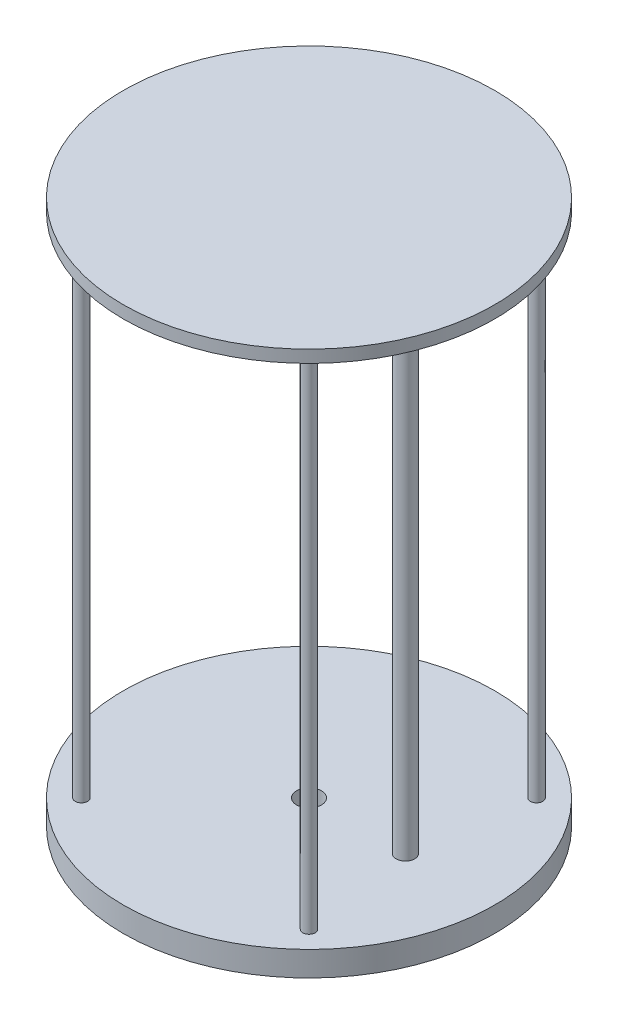
ISO-10303-21;
HEADER;
FILE_DESCRIPTION(('STEP AP214'),'2;1');
FILE_NAME('part.step','',(''),(''),'','','');
FILE_SCHEMA(('AUTOMOTIVE_DESIGN { 1 0 10303 214 1 1 1 1 }'));
ENDSEC;
DATA;
#1=APPLICATION_CONTEXT('core data for automotive mechanical design processes');
#2=APPLICATION_PROTOCOL_DEFINITION('international standard','automotive_design',2000,#1);
#3=PRODUCT_CONTEXT('',#1,'mechanical');
#4=PRODUCT('Part','Part','',(#3));
#5=PRODUCT_RELATED_PRODUCT_CATEGORY('part','',(#4));
#6=PRODUCT_DEFINITION_FORMATION('','',#4);
#7=PRODUCT_DEFINITION_CONTEXT('part definition',#1,'design');
#8=PRODUCT_DEFINITION('design','',#6,#7);
#9=PRODUCT_DEFINITION_SHAPE('','',#8);
#10=(LENGTH_UNIT() NAMED_UNIT(*) SI_UNIT(.MILLI.,.METRE.));
#11=(NAMED_UNIT(*) PLANE_ANGLE_UNIT() SI_UNIT($,.RADIAN.));
#12=(NAMED_UNIT(*) SI_UNIT($,.STERADIAN.) SOLID_ANGLE_UNIT());
#13=UNCERTAINTY_MEASURE_WITH_UNIT(LENGTH_MEASURE(1.E-05),#10,'distance_accuracy_value','');
#14=(GEOMETRIC_REPRESENTATION_CONTEXT(3) GLOBAL_UNCERTAINTY_ASSIGNED_CONTEXT((#13)) GLOBAL_UNIT_ASSIGNED_CONTEXT((#10,
#11,#12)) REPRESENTATION_CONTEXT('',''));
#15=CARTESIAN_POINT('',(0.,0.,0.));
#16=DIRECTION('',(0.,0.,1.));
#17=DIRECTION('',(1.,0.,0.));
#18=AXIS2_PLACEMENT_3D('',#15,#16,#17);
#19=CARTESIAN_POINT('',(0.,10.,0.));
#20=DIRECTION('',(0.,-1.,0.));
#21=DIRECTION('',(0.,0.,-1.));
#22=AXIS2_PLACEMENT_3D('',#19,#20,#21);
#23=CYLINDRICAL_SURFACE('',#22,75.);
#24=CARTESIAN_POINT('',(0.,10.,0.));
#25=DIRECTION('',(0.,1.,0.));
#26=DIRECTION('',(0.,0.,1.));
#27=AXIS2_PLACEMENT_3D('',#24,#25,#26);
#28=CIRCLE('',#27,75.);
#29=CARTESIAN_POINT('',(0.,10.,75.));
#30=VERTEX_POINT('',#29);
#31=EDGE_CURVE('E10',#30,#30,#28,.T.);
#32=ORIENTED_EDGE('',*,*,#31,.F.);
#33=EDGE_LOOP('',(#32));
#34=FACE_BOUND('',#33,.T.);
#35=CARTESIAN_POINT('',(0.,0.,0.));
#36=DIRECTION('',(0.,1.,0.));
#37=DIRECTION('',(0.,0.,1.));
#38=AXIS2_PLACEMENT_3D('',#35,#36,#37);
#39=CIRCLE('',#38,75.);
#40=CARTESIAN_POINT('',(0.,0.,75.));
#41=VERTEX_POINT('',#40);
#42=EDGE_CURVE('E34',#41,#41,#39,.T.);
#43=ORIENTED_EDGE('',*,*,#42,.T.);
#44=EDGE_LOOP('',(#43));
#45=FACE_BOUND('',#44,.T.);
#46=ADVANCED_FACE('F31',(#34,#45),#23,.T.);
#47=CARTESIAN_POINT('',(0.,10.,0.));
#48=DIRECTION('',(0.,1.,0.));
#49=DIRECTION('',(0.,0.,1.));
#50=AXIS2_PLACEMENT_3D('',#47,#48,#49);
#51=PLANE('',#50);
#52=CARTESIAN_POINT('',(0.,10.,0.));
#53=DIRECTION('',(0.,1.,0.));
#54=DIRECTION('',(0.,0.,1.));
#55=AXIS2_PLACEMENT_3D('',#52,#53,#54);
#56=CIRCLE('',#55,5.);
#57=CARTESIAN_POINT('',(0.,10.,5.));
#58=VERTEX_POINT('',#57);
#59=EDGE_CURVE('E81',#58,#58,#56,.F.);
#60=ORIENTED_EDGE('',*,*,#59,.T.);
#61=EDGE_LOOP('',(#60));
#62=FACE_BOUND('',#61,.T.);
#63=CARTESIAN_POINT('',(-45.9619407771257,10.,45.9619407771257));
#64=DIRECTION('',(0.,1.,0.));
#65=DIRECTION('',(0.,0.,1.));
#66=AXIS2_PLACEMENT_3D('',#63,#64,#65);
#67=CIRCLE('',#66,2.5);
#68=CARTESIAN_POINT('',(-45.9619407771257,10.,43.4619407771257));
#69=VERTEX_POINT('',#68);
#70=EDGE_CURVE('E67',#69,#69,#67,.T.);
#71=ORIENTED_EDGE('',*,*,#70,.F.);
#72=EDGE_LOOP('',(#71));
#73=FACE_BOUND('',#72,.T.);
#74=CARTESIAN_POINT('',(45.9619407771255,10.,45.9619407771257));
#75=DIRECTION('',(0.,1.,0.));
#76=DIRECTION('',(0.,0.,1.));
#77=AXIS2_PLACEMENT_3D('',#74,#75,#76);
#78=CIRCLE('',#77,2.50000000000011);
#79=CARTESIAN_POINT('',(45.9619407771255,10.,43.4619407771256));
#80=VERTEX_POINT('',#79);
#81=EDGE_CURVE('E61',#80,#80,#78,.T.);
#82=ORIENTED_EDGE('',*,*,#81,.F.);
#83=EDGE_LOOP('',(#82));
#84=FACE_BOUND('',#83,.T.);
#85=CARTESIAN_POINT('',(45.9619407771255,10.,-45.9619407771255));
#86=DIRECTION('',(0.,1.,0.));
#87=DIRECTION('',(0.,0.,1.));
#88=AXIS2_PLACEMENT_3D('',#85,#86,#87);
#89=CIRCLE('',#88,2.5);
#90=CARTESIAN_POINT('',(45.9619407771255,10.,-48.4619407771255));
#91=VERTEX_POINT('',#90);
#92=EDGE_CURVE('E55',#91,#91,#89,.T.);
#93=ORIENTED_EDGE('',*,*,#92,.F.);
#94=EDGE_LOOP('',(#93));
#95=FACE_BOUND('',#94,.T.);
#96=CARTESIAN_POINT('',(38.9619407771255,10.,0.));
#97=DIRECTION('',(0.,1.,0.));
#98=DIRECTION('',(0.,0.,1.));
#99=AXIS2_PLACEMENT_3D('',#96,#97,#98);
#100=CIRCLE('',#99,3.75000000000001);
#101=CARTESIAN_POINT('',(38.9619407771255,10.,-3.75000000000001));
#102=VERTEX_POINT('',#101);
#103=EDGE_CURVE('E49',#102,#102,#100,.T.);
#104=ORIENTED_EDGE('',*,*,#103,.F.);
#105=EDGE_LOOP('',(#104));
#106=FACE_BOUND('',#105,.T.);
#107=CARTESIAN_POINT('',(-45.9619407771257,10.,-45.9619407771255));
#108=DIRECTION('',(0.,1.,0.));
#109=DIRECTION('',(0.,0.,1.));
#110=AXIS2_PLACEMENT_3D('',#107,#108,#109);
#111=CIRCLE('',#110,2.49999999999998);
#112=CARTESIAN_POINT('',(-45.9619407771257,10.,-48.4619407771255));
#113=VERTEX_POINT('',#112);
#114=EDGE_CURVE('E43',#113,#113,#111,.T.);
#115=ORIENTED_EDGE('',*,*,#114,.F.);
#116=EDGE_LOOP('',(#115));
#117=FACE_BOUND('',#116,.T.);
#118=ORIENTED_EDGE('',*,*,#31,.T.);
#119=EDGE_LOOP('',(#118));
#120=FACE_BOUND('',#119,.T.);
#121=ADVANCED_FACE('F85',(#62,#73,#84,#95,#106,#117,#120),#51,.T.);
#122=CARTESIAN_POINT('',(0.,0.,0.));
#123=DIRECTION('',(0.,1.,0.));
#124=DIRECTION('',(0.,0.,1.));
#125=AXIS2_PLACEMENT_3D('',#122,#123,#124);
#126=PLANE('',#125);
#127=CARTESIAN_POINT('',(0.,0.,0.));
#128=DIRECTION('',(0.,-1.,0.));
#129=DIRECTION('',(0.,0.,-1.));
#130=AXIS2_PLACEMENT_3D('',#127,#128,#129);
#131=CIRCLE('',#130,5.);
#132=CARTESIAN_POINT('',(0.,0.,-5.));
#133=VERTEX_POINT('',#132);
#134=EDGE_CURVE('E76',#133,#133,#131,.T.);
#135=ORIENTED_EDGE('',*,*,#134,.F.);
#136=EDGE_LOOP('',(#135));
#137=FACE_BOUND('',#136,.T.);
#138=ORIENTED_EDGE('',*,*,#42,.F.);
#139=EDGE_LOOP('',(#138));
#140=FACE_BOUND('',#139,.T.);
#141=ADVANCED_FACE('F95',(#137,#140),#126,.F.);
#142=CARTESIAN_POINT('',(-45.9619407771257,215.,-45.9619407771255));
#143=DIRECTION('',(0.,-1.,0.));
#144=DIRECTION('',(0.,0.,-1.));
#145=AXIS2_PLACEMENT_3D('',#142,#143,#144);
#146=CYLINDRICAL_SURFACE('',#145,2.49999999999998);
#147=CARTESIAN_POINT('',(-45.9619407771257,215.,-45.9619407771255));
#148=DIRECTION('',(0.,1.,0.));
#149=DIRECTION('',(0.,0.,1.));
#150=AXIS2_PLACEMENT_3D('',#147,#148,#149);
#151=CIRCLE('',#150,2.49999999999998);
#152=CARTESIAN_POINT('',(-45.9619407771257,215.,-48.4619407771255));
#153=VERTEX_POINT('',#152);
#154=EDGE_CURVE('E41',#153,#153,#151,.T.);
#155=CARTESIAN_POINT('',(-45.9619407771257,215.,-48.4619407771255));
#156=CARTESIAN_POINT('',(-45.9619407771257,212.864583333333,-48.4619407771255));
#157=CARTESIAN_POINT('',(-45.9619407771257,210.729166666667,-48.4619407771255));
#158=CARTESIAN_POINT('',(-45.9619407771257,206.458333333333,-48.4619407771255));
#159=CARTESIAN_POINT('',(-45.9619407771257,204.322916666667,-48.4619407771255));
#160=CARTESIAN_POINT('',(-45.9619407771257,200.052083333333,-48.4619407771255));
#161=CARTESIAN_POINT('',(-45.9619407771257,197.916666666667,-48.4619407771255));
#162=CARTESIAN_POINT('',(-45.9619407771257,193.645833333333,-48.4619407771255));
#163=CARTESIAN_POINT('',(-45.9619407771257,191.510416666667,-48.4619407771255));
#164=CARTESIAN_POINT('',(-45.9619407771257,187.239583333333,-48.4619407771255));
#165=CARTESIAN_POINT('',(-45.9619407771257,185.104166666667,-48.4619407771255));
#166=CARTESIAN_POINT('',(-45.9619407771257,180.833333333333,-48.4619407771255));
#167=CARTESIAN_POINT('',(-45.9619407771257,178.697916666667,-48.4619407771255));
#168=CARTESIAN_POINT('',(-45.9619407771257,174.427083333333,-48.4619407771255));
#169=CARTESIAN_POINT('',(-45.9619407771257,172.291666666667,-48.4619407771255));
#170=CARTESIAN_POINT('',(-45.9619407771257,168.020833333333,-48.4619407771255));
#171=CARTESIAN_POINT('',(-45.9619407771257,165.885416666667,-48.4619407771255));
#172=CARTESIAN_POINT('',(-45.9619407771257,161.614583333333,-48.4619407771255));
#173=CARTESIAN_POINT('',(-45.9619407771257,159.479166666667,-48.4619407771255));
#174=CARTESIAN_POINT('',(-45.9619407771257,155.208333333333,-48.4619407771255));
#175=CARTESIAN_POINT('',(-45.9619407771257,153.072916666667,-48.4619407771255));
#176=CARTESIAN_POINT('',(-45.9619407771257,148.802083333333,-48.4619407771255));
#177=CARTESIAN_POINT('',(-45.9619407771257,146.666666666667,-48.4619407771255));
#178=CARTESIAN_POINT('',(-45.9619407771257,142.395833333333,-48.4619407771255));
#179=CARTESIAN_POINT('',(-45.9619407771257,140.260416666667,-48.4619407771255));
#180=CARTESIAN_POINT('',(-45.9619407771257,135.989583333333,-48.4619407771255));
#181=CARTESIAN_POINT('',(-45.9619407771257,133.854166666667,-48.4619407771255));
#182=CARTESIAN_POINT('',(-45.9619407771257,129.583333333333,-48.4619407771255));
#183=CARTESIAN_POINT('',(-45.9619407771257,127.447916666667,-48.4619407771255));
#184=CARTESIAN_POINT('',(-45.9619407771257,123.177083333333,-48.4619407771255));
#185=CARTESIAN_POINT('',(-45.9619407771257,121.041666666667,-48.4619407771255));
#186=CARTESIAN_POINT('',(-45.9619407771257,116.770833333333,-48.4619407771255));
#187=CARTESIAN_POINT('',(-45.9619407771257,114.635416666667,-48.4619407771255));
#188=CARTESIAN_POINT('',(-45.9619407771257,110.364583333333,-48.4619407771255));
#189=CARTESIAN_POINT('',(-45.9619407771257,108.229166666667,-48.4619407771255));
#190=CARTESIAN_POINT('',(-45.9619407771257,103.958333333333,-48.4619407771255));
#191=CARTESIAN_POINT('',(-45.9619407771257,101.822916666667,-48.4619407771255));
#192=CARTESIAN_POINT('',(-45.9619407771257,97.5520833333333,-48.4619407771255));
#193=CARTESIAN_POINT('',(-45.9619407771257,95.4166666666666,-48.4619407771255));
#194=CARTESIAN_POINT('',(-45.9619407771257,91.1458333333333,-48.4619407771255));
#195=CARTESIAN_POINT('',(-45.9619407771257,89.0104166666667,-48.4619407771255));
#196=CARTESIAN_POINT('',(-45.9619407771257,84.7395833333333,-48.4619407771255));
#197=CARTESIAN_POINT('',(-45.9619407771257,82.6041666666667,-48.4619407771255));
#198=CARTESIAN_POINT('',(-45.9619407771257,78.3333333333333,-48.4619407771255));
#199=CARTESIAN_POINT('',(-45.9619407771257,76.1979166666667,-48.4619407771255));
#200=CARTESIAN_POINT('',(-45.9619407771257,71.9270833333333,-48.4619407771255));
#201=CARTESIAN_POINT('',(-45.9619407771257,69.7916666666667,-48.4619407771255));
#202=CARTESIAN_POINT('',(-45.9619407771257,65.5208333333333,-48.4619407771255));
#203=CARTESIAN_POINT('',(-45.9619407771257,63.3854166666667,-48.4619407771255));
#204=CARTESIAN_POINT('',(-45.9619407771257,59.1145833333334,-48.4619407771255));
#205=CARTESIAN_POINT('',(-45.9619407771257,56.9791666666667,-48.4619407771255));
#206=CARTESIAN_POINT('',(-45.9619407771257,52.7083333333334,-48.4619407771255));
#207=CARTESIAN_POINT('',(-45.9619407771257,50.5729166666667,-48.4619407771255));
#208=CARTESIAN_POINT('',(-45.9619407771257,46.3020833333334,-48.4619407771255));
#209=CARTESIAN_POINT('',(-45.9619407771257,44.1666666666667,-48.4619407771255));
#210=CARTESIAN_POINT('',(-45.9619407771257,39.8958333333333,-48.4619407771255));
#211=CARTESIAN_POINT('',(-45.9619407771257,37.7604166666667,-48.4619407771255));
#212=CARTESIAN_POINT('',(-45.9619407771257,33.4895833333333,-48.4619407771255));
#213=CARTESIAN_POINT('',(-45.9619407771257,31.3541666666667,-48.4619407771255));
#214=CARTESIAN_POINT('',(-45.9619407771257,27.0833333333333,-48.4619407771255));
#215=CARTESIAN_POINT('',(-45.9619407771257,24.9479166666667,-48.4619407771255));
#216=CARTESIAN_POINT('',(-45.9619407771257,20.6770833333333,-48.4619407771255));
#217=CARTESIAN_POINT('',(-45.9619407771257,18.5416666666667,-48.4619407771255));
#218=CARTESIAN_POINT('',(-45.9619407771257,14.2708333333333,-48.4619407771255));
#219=CARTESIAN_POINT('',(-45.9619407771257,12.1354166666667,-48.4619407771255));
#220=CARTESIAN_POINT('',(-45.9619407771257,10.,-48.4619407771255));
#221=B_SPLINE_CURVE_WITH_KNOTS('',3,(#155,#156,#157,#158,#159,#160,#161,#162,#163,#164,#165,
#166,#167,#168,#169,#170,#171,#172,#173,#174,#175,#176,#177,#178,#179,#180,#181,#182,#183,#184,
#185,#186,#187,#188,#189,#190,#191,#192,#193,#194,#195,#196,#197,#198,#199,#200,#201,#202,#203,
#204,#205,#206,#207,#208,#209,#210,#211,#212,#213,#214,#215,#216,#217,#218,#219,#220),
.UNSPECIFIED.,.F.,.F.,(4,2,2,2,2,2,2,2,2,2,2,2,2,2,2,2,2,2,2,2,2,2,2,2,2,2,2,2,2,2,2,2,4),(0.,
6.40625,12.8125,19.21875,25.625,32.03125,38.4375,44.84375,51.25,57.65625,64.0625,70.46875,
76.875,83.28125,89.6875,96.09375,102.5,108.90625,115.3125,121.71875,128.125,134.53125,140.9375,
147.34375,153.75,160.15625,166.5625,172.96875,179.375,185.78125,192.1875,198.59375,205.),.UNSPECIFIED.);
#222=EDGE_CURVE('BSEAM98',#153,#113,#221,.T.);
#223=ORIENTED_EDGE('',*,*,#154,.F.);
#224=ORIENTED_EDGE('',*,*,#114,.T.);
#225=ORIENTED_EDGE('',*,*,#222,.T.);
#226=ORIENTED_EDGE('',*,*,#222,.F.);
#227=EDGE_LOOP('',(#223,#225,#224,#226));
#228=FACE_BOUND('',#227,.T.);
#229=ADVANCED_FACE('F98',(#228),#146,.T.);
#230=CARTESIAN_POINT('',(38.9619407771255,215.,0.));
#231=DIRECTION('',(0.,-1.,0.));
#232=DIRECTION('',(0.,0.,-1.));
#233=AXIS2_PLACEMENT_3D('',#230,#231,#232);
#234=CYLINDRICAL_SURFACE('',#233,3.75000000000001);
#235=CARTESIAN_POINT('',(38.9619407771255,215.,0.));
#236=DIRECTION('',(0.,1.,0.));
#237=DIRECTION('',(0.,0.,1.));
#238=AXIS2_PLACEMENT_3D('',#235,#236,#237);
#239=CIRCLE('',#238,3.75000000000001);
#240=CARTESIAN_POINT('',(38.9619407771255,215.,-3.75000000000001));
#241=VERTEX_POINT('',#240);
#242=EDGE_CURVE('E46',#241,#241,#239,.T.);
#243=CARTESIAN_POINT('',(38.9619407771255,215.,-3.75000000000001));
#244=CARTESIAN_POINT('',(38.9619407771255,212.864583333333,-3.75000000000001));
#245=CARTESIAN_POINT('',(38.9619407771255,210.729166666667,-3.75000000000001));
#246=CARTESIAN_POINT('',(38.9619407771255,206.458333333333,-3.75000000000001));
#247=CARTESIAN_POINT('',(38.9619407771255,204.322916666667,-3.75000000000001));
#248=CARTESIAN_POINT('',(38.9619407771255,200.052083333333,-3.75000000000001));
#249=CARTESIAN_POINT('',(38.9619407771255,197.916666666667,-3.75000000000001));
#250=CARTESIAN_POINT('',(38.9619407771255,193.645833333333,-3.75000000000001));
#251=CARTESIAN_POINT('',(38.9619407771255,191.510416666667,-3.75000000000001));
#252=CARTESIAN_POINT('',(38.9619407771255,187.239583333333,-3.75000000000001));
#253=CARTESIAN_POINT('',(38.9619407771255,185.104166666667,-3.75000000000001));
#254=CARTESIAN_POINT('',(38.9619407771255,180.833333333333,-3.75000000000001));
#255=CARTESIAN_POINT('',(38.9619407771255,178.697916666667,-3.75000000000001));
#256=CARTESIAN_POINT('',(38.9619407771255,174.427083333333,-3.75000000000001));
#257=CARTESIAN_POINT('',(38.9619407771255,172.291666666667,-3.75000000000001));
#258=CARTESIAN_POINT('',(38.9619407771255,168.020833333333,-3.75000000000001));
#259=CARTESIAN_POINT('',(38.9619407771255,165.885416666667,-3.75000000000001));
#260=CARTESIAN_POINT('',(38.9619407771255,161.614583333333,-3.75000000000001));
#261=CARTESIAN_POINT('',(38.9619407771255,159.479166666667,-3.75000000000001));
#262=CARTESIAN_POINT('',(38.9619407771255,155.208333333333,-3.75000000000001));
#263=CARTESIAN_POINT('',(38.9619407771255,153.072916666667,-3.75000000000001));
#264=CARTESIAN_POINT('',(38.9619407771255,148.802083333333,-3.75000000000001));
#265=CARTESIAN_POINT('',(38.9619407771255,146.666666666667,-3.75000000000001));
#266=CARTESIAN_POINT('',(38.9619407771255,142.395833333333,-3.75000000000001));
#267=CARTESIAN_POINT('',(38.9619407771255,140.260416666667,-3.75000000000001));
#268=CARTESIAN_POINT('',(38.9619407771255,135.989583333333,-3.75000000000001));
#269=CARTESIAN_POINT('',(38.9619407771255,133.854166666667,-3.75000000000001));
#270=CARTESIAN_POINT('',(38.9619407771255,129.583333333333,-3.75000000000001));
#271=CARTESIAN_POINT('',(38.9619407771255,127.447916666667,-3.75000000000001));
#272=CARTESIAN_POINT('',(38.9619407771255,123.177083333333,-3.75000000000001));
#273=CARTESIAN_POINT('',(38.9619407771255,121.041666666667,-3.75000000000001));
#274=CARTESIAN_POINT('',(38.9619407771255,116.770833333333,-3.75000000000001));
#275=CARTESIAN_POINT('',(38.9619407771255,114.635416666667,-3.75000000000001));
#276=CARTESIAN_POINT('',(38.9619407771255,110.364583333333,-3.75000000000001));
#277=CARTESIAN_POINT('',(38.9619407771255,108.229166666667,-3.75000000000001));
#278=CARTESIAN_POINT('',(38.9619407771255,103.958333333333,-3.75000000000001));
#279=CARTESIAN_POINT('',(38.9619407771255,101.822916666667,-3.75000000000001));
#280=CARTESIAN_POINT('',(38.9619407771255,97.5520833333333,-3.75000000000001));
#281=CARTESIAN_POINT('',(38.9619407771255,95.4166666666667,-3.75000000000001));
#282=CARTESIAN_POINT('',(38.9619407771255,91.1458333333333,-3.75000000000001));
#283=CARTESIAN_POINT('',(38.9619407771255,89.0104166666667,-3.75000000000001));
#284=CARTESIAN_POINT('',(38.9619407771255,84.7395833333333,-3.75000000000001));
#285=CARTESIAN_POINT('',(38.9619407771255,82.6041666666667,-3.75000000000001));
#286=CARTESIAN_POINT('',(38.9619407771255,78.3333333333333,-3.75000000000001));
#287=CARTESIAN_POINT('',(38.9619407771255,76.1979166666667,-3.75000000000001));
#288=CARTESIAN_POINT('',(38.9619407771255,71.9270833333333,-3.75000000000001));
#289=CARTESIAN_POINT('',(38.9619407771255,69.7916666666667,-3.75000000000001));
#290=CARTESIAN_POINT('',(38.9619407771255,65.5208333333333,-3.75000000000001));
#291=CARTESIAN_POINT('',(38.9619407771255,63.3854166666667,-3.75000000000001));
#292=CARTESIAN_POINT('',(38.9619407771255,59.1145833333333,-3.75000000000001));
#293=CARTESIAN_POINT('',(38.9619407771255,56.9791666666667,-3.75000000000001));
#294=CARTESIAN_POINT('',(38.9619407771255,52.7083333333333,-3.75000000000001));
#295=CARTESIAN_POINT('',(38.9619407771255,50.5729166666667,-3.75000000000001));
#296=CARTESIAN_POINT('',(38.9619407771255,46.3020833333333,-3.75000000000001));
#297=CARTESIAN_POINT('',(38.9619407771255,44.1666666666667,-3.75000000000001));
#298=CARTESIAN_POINT('',(38.9619407771255,39.8958333333333,-3.75000000000001));
#299=CARTESIAN_POINT('',(38.9619407771255,37.7604166666667,-3.75000000000001));
#300=CARTESIAN_POINT('',(38.9619407771255,33.4895833333333,-3.75000000000001));
#301=CARTESIAN_POINT('',(38.9619407771255,31.3541666666667,-3.75000000000001));
#302=CARTESIAN_POINT('',(38.9619407771255,27.0833333333333,-3.75000000000001));
#303=CARTESIAN_POINT('',(38.9619407771255,24.9479166666667,-3.75000000000001));
#304=CARTESIAN_POINT('',(38.9619407771255,20.6770833333333,-3.75000000000001));
#305=CARTESIAN_POINT('',(38.9619407771255,18.5416666666667,-3.75000000000001));
#306=CARTESIAN_POINT('',(38.9619407771255,14.2708333333333,-3.75000000000001));
#307=CARTESIAN_POINT('',(38.9619407771255,12.1354166666667,-3.75000000000001));
#308=CARTESIAN_POINT('',(38.9619407771255,10.,-3.75000000000001));
#309=B_SPLINE_CURVE_WITH_KNOTS('',3,(#243,#244,#245,#246,#247,#248,#249,#250,#251,#252,#253,
#254,#255,#256,#257,#258,#259,#260,#261,#262,#263,#264,#265,#266,#267,#268,#269,#270,#271,#272,
#273,#274,#275,#276,#277,#278,#279,#280,#281,#282,#283,#284,#285,#286,#287,#288,#289,#290,#291,
#292,#293,#294,#295,#296,#297,#298,#299,#300,#301,#302,#303,#304,#305,#306,#307,#308),
.UNSPECIFIED.,.F.,.F.,(4,2,2,2,2,2,2,2,2,2,2,2,2,2,2,2,2,2,2,2,2,2,2,2,2,2,2,2,2,2,2,2,4),(0.,
6.40624999999997,12.8125,19.21875,25.625,32.03125,38.4375,44.84375,51.25,57.65625,64.0625,
70.46875,76.875,83.28125,89.6875,96.09375,102.5,108.90625,115.3125,121.71875,128.125,134.53125,
140.9375,147.34375,153.75,160.15625,166.5625,172.96875,179.375,185.78125,192.1875,198.59375,
205.),.UNSPECIFIED.);
#310=EDGE_CURVE('BSEAM112',#241,#102,#309,.T.);
#311=ORIENTED_EDGE('',*,*,#242,.F.);
#312=ORIENTED_EDGE('',*,*,#103,.T.);
#313=ORIENTED_EDGE('',*,*,#310,.T.);
#314=ORIENTED_EDGE('',*,*,#310,.F.);
#315=EDGE_LOOP('',(#311,#313,#312,#314));
#316=FACE_BOUND('',#315,.T.);
#317=ADVANCED_FACE('F112',(#316),#234,.T.);
#318=CARTESIAN_POINT('',(45.9619407771255,215.,-45.9619407771255));
#319=DIRECTION('',(0.,-1.,0.));
#320=DIRECTION('',(0.,0.,-1.));
#321=AXIS2_PLACEMENT_3D('',#318,#319,#320);
#322=CYLINDRICAL_SURFACE('',#321,2.5);
#323=CARTESIAN_POINT('',(45.9619407771255,215.,-45.9619407771255));
#324=DIRECTION('',(0.,1.,0.));
#325=DIRECTION('',(0.,0.,1.));
#326=AXIS2_PLACEMENT_3D('',#323,#324,#325);
#327=CIRCLE('',#326,2.5);
#328=CARTESIAN_POINT('',(45.9619407771255,215.,-48.4619407771255));
#329=VERTEX_POINT('',#328);
#330=EDGE_CURVE('E52',#329,#329,#327,.T.);
#331=CARTESIAN_POINT('',(45.9619407771255,215.,-48.4619407771255));
#332=CARTESIAN_POINT('',(45.9619407771255,212.864583333333,-48.4619407771255));
#333=CARTESIAN_POINT('',(45.9619407771255,210.729166666667,-48.4619407771255));
#334=CARTESIAN_POINT('',(45.9619407771255,206.458333333333,-48.4619407771255));
#335=CARTESIAN_POINT('',(45.9619407771255,204.322916666667,-48.4619407771255));
#336=CARTESIAN_POINT('',(45.9619407771255,200.052083333333,-48.4619407771255));
#337=CARTESIAN_POINT('',(45.9619407771255,197.916666666667,-48.4619407771255));
#338=CARTESIAN_POINT('',(45.9619407771255,193.645833333333,-48.4619407771255));
#339=CARTESIAN_POINT('',(45.9619407771255,191.510416666667,-48.4619407771255));
#340=CARTESIAN_POINT('',(45.9619407771255,187.239583333333,-48.4619407771255));
#341=CARTESIAN_POINT('',(45.9619407771255,185.104166666667,-48.4619407771255));
#342=CARTESIAN_POINT('',(45.9619407771255,180.833333333333,-48.4619407771255));
#343=CARTESIAN_POINT('',(45.9619407771255,178.697916666667,-48.4619407771255));
#344=CARTESIAN_POINT('',(45.9619407771255,174.427083333333,-48.4619407771255));
#345=CARTESIAN_POINT('',(45.9619407771255,172.291666666667,-48.4619407771255));
#346=CARTESIAN_POINT('',(45.9619407771255,168.020833333333,-48.4619407771255));
#347=CARTESIAN_POINT('',(45.9619407771255,165.885416666667,-48.4619407771255));
#348=CARTESIAN_POINT('',(45.9619407771255,161.614583333333,-48.4619407771255));
#349=CARTESIAN_POINT('',(45.9619407771255,159.479166666667,-48.4619407771255));
#350=CARTESIAN_POINT('',(45.9619407771255,155.208333333333,-48.4619407771255));
#351=CARTESIAN_POINT('',(45.9619407771255,153.072916666667,-48.4619407771255));
#352=CARTESIAN_POINT('',(45.9619407771255,148.802083333333,-48.4619407771255));
#353=CARTESIAN_POINT('',(45.9619407771255,146.666666666667,-48.4619407771255));
#354=CARTESIAN_POINT('',(45.9619407771255,142.395833333333,-48.4619407771255));
#355=CARTESIAN_POINT('',(45.9619407771255,140.260416666667,-48.4619407771255));
#356=CARTESIAN_POINT('',(45.9619407771255,135.989583333333,-48.4619407771255));
#357=CARTESIAN_POINT('',(45.9619407771255,133.854166666667,-48.4619407771255));
#358=CARTESIAN_POINT('',(45.9619407771255,129.583333333333,-48.4619407771255));
#359=CARTESIAN_POINT('',(45.9619407771255,127.447916666667,-48.4619407771255));
#360=CARTESIAN_POINT('',(45.9619407771255,123.177083333333,-48.4619407771255));
#361=CARTESIAN_POINT('',(45.9619407771255,121.041666666667,-48.4619407771255));
#362=CARTESIAN_POINT('',(45.9619407771255,116.770833333333,-48.4619407771255));
#363=CARTESIAN_POINT('',(45.9619407771255,114.635416666667,-48.4619407771255));
#364=CARTESIAN_POINT('',(45.9619407771255,110.364583333333,-48.4619407771255));
#365=CARTESIAN_POINT('',(45.9619407771255,108.229166666667,-48.4619407771255));
#366=CARTESIAN_POINT('',(45.9619407771255,103.958333333333,-48.4619407771255));
#367=CARTESIAN_POINT('',(45.9619407771255,101.822916666667,-48.4619407771255));
#368=CARTESIAN_POINT('',(45.9619407771255,97.5520833333333,-48.4619407771255));
#369=CARTESIAN_POINT('',(45.9619407771255,95.4166666666666,-48.4619407771255));
#370=CARTESIAN_POINT('',(45.9619407771255,91.1458333333333,-48.4619407771255));
#371=CARTESIAN_POINT('',(45.9619407771255,89.0104166666667,-48.4619407771255));
#372=CARTESIAN_POINT('',(45.9619407771255,84.7395833333333,-48.4619407771255));
#373=CARTESIAN_POINT('',(45.9619407771255,82.6041666666667,-48.4619407771255));
#374=CARTESIAN_POINT('',(45.9619407771255,78.3333333333333,-48.4619407771255));
#375=CARTESIAN_POINT('',(45.9619407771255,76.1979166666667,-48.4619407771255));
#376=CARTESIAN_POINT('',(45.9619407771255,71.9270833333333,-48.4619407771255));
#377=CARTESIAN_POINT('',(45.9619407771255,69.7916666666667,-48.4619407771255));
#378=CARTESIAN_POINT('',(45.9619407771255,65.5208333333333,-48.4619407771255));
#379=CARTESIAN_POINT('',(45.9619407771255,63.3854166666667,-48.4619407771255));
#380=CARTESIAN_POINT('',(45.9619407771255,59.1145833333334,-48.4619407771255));
#381=CARTESIAN_POINT('',(45.9619407771255,56.9791666666667,-48.4619407771255));
#382=CARTESIAN_POINT('',(45.9619407771255,52.7083333333334,-48.4619407771255));
#383=CARTESIAN_POINT('',(45.9619407771255,50.5729166666667,-48.4619407771255));
#384=CARTESIAN_POINT('',(45.9619407771255,46.3020833333334,-48.4619407771255));
#385=CARTESIAN_POINT('',(45.9619407771255,44.1666666666667,-48.4619407771255));
#386=CARTESIAN_POINT('',(45.9619407771255,39.8958333333333,-48.4619407771255));
#387=CARTESIAN_POINT('',(45.9619407771255,37.7604166666667,-48.4619407771255));
#388=CARTESIAN_POINT('',(45.9619407771255,33.4895833333333,-48.4619407771255));
#389=CARTESIAN_POINT('',(45.9619407771255,31.3541666666667,-48.4619407771255));
#390=CARTESIAN_POINT('',(45.9619407771255,27.0833333333333,-48.4619407771255));
#391=CARTESIAN_POINT('',(45.9619407771255,24.9479166666667,-48.4619407771255));
#392=CARTESIAN_POINT('',(45.9619407771255,20.6770833333333,-48.4619407771255));
#393=CARTESIAN_POINT('',(45.9619407771255,18.5416666666667,-48.4619407771255));
#394=CARTESIAN_POINT('',(45.9619407771255,14.2708333333333,-48.4619407771255));
#395=CARTESIAN_POINT('',(45.9619407771255,12.1354166666667,-48.4619407771255));
#396=CARTESIAN_POINT('',(45.9619407771255,10.,-48.4619407771255));
#397=B_SPLINE_CURVE_WITH_KNOTS('',3,(#331,#332,#333,#334,#335,#336,#337,#338,#339,#340,#341,
#342,#343,#344,#345,#346,#347,#348,#349,#350,#351,#352,#353,#354,#355,#356,#357,#358,#359,#360,
#361,#362,#363,#364,#365,#366,#367,#368,#369,#370,#371,#372,#373,#374,#375,#376,#377,#378,#379,
#380,#381,#382,#383,#384,#385,#386,#387,#388,#389,#390,#391,#392,#393,#394,#395,#396),
.UNSPECIFIED.,.F.,.F.,(4,2,2,2,2,2,2,2,2,2,2,2,2,2,2,2,2,2,2,2,2,2,2,2,2,2,2,2,2,2,2,2,4),(0.,
6.40625,12.8125,19.21875,25.625,32.03125,38.4375,44.84375,51.25,57.65625,64.0625,70.46875,
76.875,83.28125,89.6875,96.09375,102.5,108.90625,115.3125,121.71875,128.125,134.53125,140.9375,
147.34375,153.75,160.15625,166.5625,172.96875,179.375,185.78125,192.1875,198.59375,205.),.UNSPECIFIED.);
#398=EDGE_CURVE('BSEAM116',#329,#91,#397,.T.);
#399=ORIENTED_EDGE('',*,*,#330,.F.);
#400=ORIENTED_EDGE('',*,*,#92,.T.);
#401=ORIENTED_EDGE('',*,*,#398,.T.);
#402=ORIENTED_EDGE('',*,*,#398,.F.);
#403=EDGE_LOOP('',(#399,#401,#400,#402));
#404=FACE_BOUND('',#403,.T.);
#405=ADVANCED_FACE('F116',(#404),#322,.T.);
#406=CARTESIAN_POINT('',(45.9619407771255,215.,45.9619407771257));
#407=DIRECTION('',(0.,-1.,0.));
#408=DIRECTION('',(0.,0.,-1.));
#409=AXIS2_PLACEMENT_3D('',#406,#407,#408);
#410=CYLINDRICAL_SURFACE('',#409,2.50000000000011);
#411=CARTESIAN_POINT('',(45.9619407771255,215.,45.9619407771257));
#412=DIRECTION('',(0.,1.,0.));
#413=DIRECTION('',(0.,0.,1.));
#414=AXIS2_PLACEMENT_3D('',#411,#412,#413);
#415=CIRCLE('',#414,2.50000000000011);
#416=CARTESIAN_POINT('',(45.9619407771255,215.,43.4619407771256));
#417=VERTEX_POINT('',#416);
#418=EDGE_CURVE('E58',#417,#417,#415,.T.);
#419=CARTESIAN_POINT('',(45.9619407771255,215.,43.4619407771256));
#420=CARTESIAN_POINT('',(45.9619407771255,212.864583333333,43.4619407771256));
#421=CARTESIAN_POINT('',(45.9619407771255,210.729166666667,43.4619407771256));
#422=CARTESIAN_POINT('',(45.9619407771255,206.458333333333,43.4619407771256));
#423=CARTESIAN_POINT('',(45.9619407771255,204.322916666667,43.4619407771256));
#424=CARTESIAN_POINT('',(45.9619407771255,200.052083333333,43.4619407771256));
#425=CARTESIAN_POINT('',(45.9619407771255,197.916666666667,43.4619407771256));
#426=CARTESIAN_POINT('',(45.9619407771255,193.645833333333,43.4619407771256));
#427=CARTESIAN_POINT('',(45.9619407771255,191.510416666667,43.4619407771256));
#428=CARTESIAN_POINT('',(45.9619407771255,187.239583333333,43.4619407771256));
#429=CARTESIAN_POINT('',(45.9619407771255,185.104166666667,43.4619407771256));
#430=CARTESIAN_POINT('',(45.9619407771255,180.833333333333,43.4619407771256));
#431=CARTESIAN_POINT('',(45.9619407771255,178.697916666667,43.4619407771256));
#432=CARTESIAN_POINT('',(45.9619407771255,174.427083333333,43.4619407771256));
#433=CARTESIAN_POINT('',(45.9619407771255,172.291666666667,43.4619407771256));
#434=CARTESIAN_POINT('',(45.9619407771255,168.020833333333,43.4619407771256));
#435=CARTESIAN_POINT('',(45.9619407771255,165.885416666667,43.4619407771256));
#436=CARTESIAN_POINT('',(45.9619407771255,161.614583333333,43.4619407771256));
#437=CARTESIAN_POINT('',(45.9619407771255,159.479166666667,43.4619407771256));
#438=CARTESIAN_POINT('',(45.9619407771255,155.208333333333,43.4619407771256));
#439=CARTESIAN_POINT('',(45.9619407771255,153.072916666667,43.4619407771256));
#440=CARTESIAN_POINT('',(45.9619407771255,148.802083333333,43.4619407771256));
#441=CARTESIAN_POINT('',(45.9619407771255,146.666666666667,43.4619407771256));
#442=CARTESIAN_POINT('',(45.9619407771255,142.395833333333,43.4619407771256));
#443=CARTESIAN_POINT('',(45.9619407771255,140.260416666667,43.4619407771256));
#444=CARTESIAN_POINT('',(45.9619407771255,135.989583333333,43.4619407771256));
#445=CARTESIAN_POINT('',(45.9619407771255,133.854166666667,43.4619407771256));
#446=CARTESIAN_POINT('',(45.9619407771255,129.583333333333,43.4619407771256));
#447=CARTESIAN_POINT('',(45.9619407771255,127.447916666667,43.4619407771256));
#448=CARTESIAN_POINT('',(45.9619407771255,123.177083333333,43.4619407771256));
#449=CARTESIAN_POINT('',(45.9619407771255,121.041666666667,43.4619407771256));
#450=CARTESIAN_POINT('',(45.9619407771255,116.770833333333,43.4619407771256));
#451=CARTESIAN_POINT('',(45.9619407771255,114.635416666667,43.4619407771256));
#452=CARTESIAN_POINT('',(45.9619407771255,110.364583333333,43.4619407771256));
#453=CARTESIAN_POINT('',(45.9619407771255,108.229166666667,43.4619407771256));
#454=CARTESIAN_POINT('',(45.9619407771255,103.958333333333,43.4619407771256));
#455=CARTESIAN_POINT('',(45.9619407771255,101.822916666667,43.4619407771256));
#456=CARTESIAN_POINT('',(45.9619407771255,97.5520833333333,43.4619407771256));
#457=CARTESIAN_POINT('',(45.9619407771255,95.4166666666666,43.4619407771256));
#458=CARTESIAN_POINT('',(45.9619407771255,91.1458333333333,43.4619407771256));
#459=CARTESIAN_POINT('',(45.9619407771255,89.0104166666667,43.4619407771256));
#460=CARTESIAN_POINT('',(45.9619407771255,84.7395833333333,43.4619407771256));
#461=CARTESIAN_POINT('',(45.9619407771255,82.6041666666667,43.4619407771256));
#462=CARTESIAN_POINT('',(45.9619407771255,78.3333333333333,43.4619407771256));
#463=CARTESIAN_POINT('',(45.9619407771255,76.1979166666667,43.4619407771256));
#464=CARTESIAN_POINT('',(45.9619407771255,71.9270833333333,43.4619407771256));
#465=CARTESIAN_POINT('',(45.9619407771255,69.7916666666667,43.4619407771256));
#466=CARTESIAN_POINT('',(45.9619407771255,65.5208333333333,43.4619407771256));
#467=CARTESIAN_POINT('',(45.9619407771255,63.3854166666667,43.4619407771256));
#468=CARTESIAN_POINT('',(45.9619407771255,59.1145833333334,43.4619407771256));
#469=CARTESIAN_POINT('',(45.9619407771255,56.9791666666667,43.4619407771256));
#470=CARTESIAN_POINT('',(45.9619407771255,52.7083333333334,43.4619407771256));
#471=CARTESIAN_POINT('',(45.9619407771255,50.5729166666667,43.4619407771256));
#472=CARTESIAN_POINT('',(45.9619407771255,46.3020833333334,43.4619407771256));
#473=CARTESIAN_POINT('',(45.9619407771255,44.1666666666667,43.4619407771256));
#474=CARTESIAN_POINT('',(45.9619407771255,39.8958333333333,43.4619407771256));
#475=CARTESIAN_POINT('',(45.9619407771255,37.7604166666667,43.4619407771256));
#476=CARTESIAN_POINT('',(45.9619407771255,33.4895833333333,43.4619407771256));
#477=CARTESIAN_POINT('',(45.9619407771255,31.3541666666667,43.4619407771256));
#478=CARTESIAN_POINT('',(45.9619407771255,27.0833333333333,43.4619407771256));
#479=CARTESIAN_POINT('',(45.9619407771255,24.9479166666667,43.4619407771256));
#480=CARTESIAN_POINT('',(45.9619407771255,20.6770833333333,43.4619407771256));
#481=CARTESIAN_POINT('',(45.9619407771255,18.5416666666667,43.4619407771256));
#482=CARTESIAN_POINT('',(45.9619407771255,14.2708333333333,43.4619407771256));
#483=CARTESIAN_POINT('',(45.9619407771255,12.1354166666667,43.4619407771256));
#484=CARTESIAN_POINT('',(45.9619407771255,10.,43.4619407771256));
#485=B_SPLINE_CURVE_WITH_KNOTS('',3,(#419,#420,#421,#422,#423,#424,#425,#426,#427,#428,#429,
#430,#431,#432,#433,#434,#435,#436,#437,#438,#439,#440,#441,#442,#443,#444,#445,#446,#447,#448,
#449,#450,#451,#452,#453,#454,#455,#456,#457,#458,#459,#460,#461,#462,#463,#464,#465,#466,#467,
#468,#469,#470,#471,#472,#473,#474,#475,#476,#477,#478,#479,#480,#481,#482,#483,#484),
.UNSPECIFIED.,.F.,.F.,(4,2,2,2,2,2,2,2,2,2,2,2,2,2,2,2,2,2,2,2,2,2,2,2,2,2,2,2,2,2,2,2,4),(0.,
6.40625,12.8125,19.21875,25.625,32.03125,38.4375,44.84375,51.25,57.65625,64.0625,70.46875,
76.875,83.28125,89.6875,96.09375,102.5,108.90625,115.3125,121.71875,128.125,134.53125,140.9375,
147.34375,153.75,160.15625,166.5625,172.96875,179.375,185.78125,192.1875,198.59375,205.),.UNSPECIFIED.);
#486=EDGE_CURVE('BSEAM120',#417,#80,#485,.T.);
#487=ORIENTED_EDGE('',*,*,#418,.F.);
#488=ORIENTED_EDGE('',*,*,#81,.T.);
#489=ORIENTED_EDGE('',*,*,#486,.T.);
#490=ORIENTED_EDGE('',*,*,#486,.F.);
#491=EDGE_LOOP('',(#487,#489,#488,#490));
#492=FACE_BOUND('',#491,.T.);
#493=ADVANCED_FACE('F120',(#492),#410,.T.);
#494=CARTESIAN_POINT('',(-45.9619407771257,215.,45.9619407771257));
#495=DIRECTION('',(0.,-1.,0.));
#496=DIRECTION('',(0.,0.,-1.));
#497=AXIS2_PLACEMENT_3D('',#494,#495,#496);
#498=CYLINDRICAL_SURFACE('',#497,2.5);
#499=CARTESIAN_POINT('',(-45.9619407771257,215.,45.9619407771257));
#500=DIRECTION('',(0.,1.,0.));
#501=DIRECTION('',(0.,0.,1.));
#502=AXIS2_PLACEMENT_3D('',#499,#500,#501);
#503=CIRCLE('',#502,2.5);
#504=CARTESIAN_POINT('',(-45.9619407771257,215.,43.4619407771257));
#505=VERTEX_POINT('',#504);
#506=EDGE_CURVE('E64',#505,#505,#503,.T.);
#507=CARTESIAN_POINT('',(-45.9619407771257,215.,43.4619407771257));
#508=CARTESIAN_POINT('',(-45.9619407771257,212.864583333333,43.4619407771257));
#509=CARTESIAN_POINT('',(-45.9619407771257,210.729166666667,43.4619407771257));
#510=CARTESIAN_POINT('',(-45.9619407771257,206.458333333333,43.4619407771257));
#511=CARTESIAN_POINT('',(-45.9619407771257,204.322916666667,43.4619407771257));
#512=CARTESIAN_POINT('',(-45.9619407771257,200.052083333333,43.4619407771257));
#513=CARTESIAN_POINT('',(-45.9619407771257,197.916666666667,43.4619407771257));
#514=CARTESIAN_POINT('',(-45.9619407771257,193.645833333333,43.4619407771257));
#515=CARTESIAN_POINT('',(-45.9619407771257,191.510416666667,43.4619407771257));
#516=CARTESIAN_POINT('',(-45.9619407771257,187.239583333333,43.4619407771257));
#517=CARTESIAN_POINT('',(-45.9619407771257,185.104166666667,43.4619407771257));
#518=CARTESIAN_POINT('',(-45.9619407771257,180.833333333333,43.4619407771257));
#519=CARTESIAN_POINT('',(-45.9619407771257,178.697916666667,43.4619407771257));
#520=CARTESIAN_POINT('',(-45.9619407771257,174.427083333333,43.4619407771257));
#521=CARTESIAN_POINT('',(-45.9619407771257,172.291666666667,43.4619407771257));
#522=CARTESIAN_POINT('',(-45.9619407771257,168.020833333333,43.4619407771257));
#523=CARTESIAN_POINT('',(-45.9619407771257,165.885416666667,43.4619407771257));
#524=CARTESIAN_POINT('',(-45.9619407771257,161.614583333333,43.4619407771257));
#525=CARTESIAN_POINT('',(-45.9619407771257,159.479166666667,43.4619407771257));
#526=CARTESIAN_POINT('',(-45.9619407771257,155.208333333333,43.4619407771257));
#527=CARTESIAN_POINT('',(-45.9619407771257,153.072916666667,43.4619407771257));
#528=CARTESIAN_POINT('',(-45.9619407771257,148.802083333333,43.4619407771257));
#529=CARTESIAN_POINT('',(-45.9619407771257,146.666666666667,43.4619407771257));
#530=CARTESIAN_POINT('',(-45.9619407771257,142.395833333333,43.4619407771257));
#531=CARTESIAN_POINT('',(-45.9619407771257,140.260416666667,43.4619407771257));
#532=CARTESIAN_POINT('',(-45.9619407771257,135.989583333333,43.4619407771257));
#533=CARTESIAN_POINT('',(-45.9619407771257,133.854166666667,43.4619407771257));
#534=CARTESIAN_POINT('',(-45.9619407771257,129.583333333333,43.4619407771257));
#535=CARTESIAN_POINT('',(-45.9619407771257,127.447916666667,43.4619407771257));
#536=CARTESIAN_POINT('',(-45.9619407771257,123.177083333333,43.4619407771257));
#537=CARTESIAN_POINT('',(-45.9619407771257,121.041666666667,43.4619407771257));
#538=CARTESIAN_POINT('',(-45.9619407771257,116.770833333333,43.4619407771257));
#539=CARTESIAN_POINT('',(-45.9619407771257,114.635416666667,43.4619407771257));
#540=CARTESIAN_POINT('',(-45.9619407771257,110.364583333333,43.4619407771257));
#541=CARTESIAN_POINT('',(-45.9619407771257,108.229166666667,43.4619407771257));
#542=CARTESIAN_POINT('',(-45.9619407771257,103.958333333333,43.4619407771257));
#543=CARTESIAN_POINT('',(-45.9619407771257,101.822916666667,43.4619407771257));
#544=CARTESIAN_POINT('',(-45.9619407771257,97.5520833333333,43.4619407771257));
#545=CARTESIAN_POINT('',(-45.9619407771257,95.4166666666666,43.4619407771257));
#546=CARTESIAN_POINT('',(-45.9619407771257,91.1458333333333,43.4619407771257));
#547=CARTESIAN_POINT('',(-45.9619407771257,89.0104166666667,43.4619407771257));
#548=CARTESIAN_POINT('',(-45.9619407771257,84.7395833333333,43.4619407771257));
#549=CARTESIAN_POINT('',(-45.9619407771257,82.6041666666667,43.4619407771257));
#550=CARTESIAN_POINT('',(-45.9619407771257,78.3333333333333,43.4619407771257));
#551=CARTESIAN_POINT('',(-45.9619407771257,76.1979166666667,43.4619407771257));
#552=CARTESIAN_POINT('',(-45.9619407771257,71.9270833333333,43.4619407771257));
#553=CARTESIAN_POINT('',(-45.9619407771257,69.7916666666667,43.4619407771257));
#554=CARTESIAN_POINT('',(-45.9619407771257,65.5208333333333,43.4619407771257));
#555=CARTESIAN_POINT('',(-45.9619407771257,63.3854166666667,43.4619407771257));
#556=CARTESIAN_POINT('',(-45.9619407771257,59.1145833333334,43.4619407771257));
#557=CARTESIAN_POINT('',(-45.9619407771257,56.9791666666667,43.4619407771257));
#558=CARTESIAN_POINT('',(-45.9619407771257,52.7083333333334,43.4619407771257));
#559=CARTESIAN_POINT('',(-45.9619407771257,50.5729166666667,43.4619407771257));
#560=CARTESIAN_POINT('',(-45.9619407771257,46.3020833333334,43.4619407771257));
#561=CARTESIAN_POINT('',(-45.9619407771257,44.1666666666667,43.4619407771257));
#562=CARTESIAN_POINT('',(-45.9619407771257,39.8958333333333,43.4619407771257));
#563=CARTESIAN_POINT('',(-45.9619407771257,37.7604166666667,43.4619407771257));
#564=CARTESIAN_POINT('',(-45.9619407771257,33.4895833333333,43.4619407771257));
#565=CARTESIAN_POINT('',(-45.9619407771257,31.3541666666667,43.4619407771257));
#566=CARTESIAN_POINT('',(-45.9619407771257,27.0833333333333,43.4619407771257));
#567=CARTESIAN_POINT('',(-45.9619407771257,24.9479166666667,43.4619407771257));
#568=CARTESIAN_POINT('',(-45.9619407771257,20.6770833333333,43.4619407771257));
#569=CARTESIAN_POINT('',(-45.9619407771257,18.5416666666667,43.4619407771257));
#570=CARTESIAN_POINT('',(-45.9619407771257,14.2708333333333,43.4619407771257));
#571=CARTESIAN_POINT('',(-45.9619407771257,12.1354166666667,43.4619407771257));
#572=CARTESIAN_POINT('',(-45.9619407771257,10.,43.4619407771257));
#573=B_SPLINE_CURVE_WITH_KNOTS('',3,(#507,#508,#509,#510,#511,#512,#513,#514,#515,#516,#517,
#518,#519,#520,#521,#522,#523,#524,#525,#526,#527,#528,#529,#530,#531,#532,#533,#534,#535,#536,
#537,#538,#539,#540,#541,#542,#543,#544,#545,#546,#547,#548,#549,#550,#551,#552,#553,#554,#555,
#556,#557,#558,#559,#560,#561,#562,#563,#564,#565,#566,#567,#568,#569,#570,#571,#572),
.UNSPECIFIED.,.F.,.F.,(4,2,2,2,2,2,2,2,2,2,2,2,2,2,2,2,2,2,2,2,2,2,2,2,2,2,2,2,2,2,2,2,4),(0.,
6.40625,12.8125,19.21875,25.625,32.03125,38.4375,44.84375,51.25,57.65625,64.0625,70.46875,
76.875,83.28125,89.6875,96.09375,102.5,108.90625,115.3125,121.71875,128.125,134.53125,140.9375,
147.34375,153.75,160.15625,166.5625,172.96875,179.375,185.78125,192.1875,198.59375,205.),.UNSPECIFIED.);
#574=EDGE_CURVE('BSEAM124',#505,#69,#573,.T.);
#575=ORIENTED_EDGE('',*,*,#506,.F.);
#576=ORIENTED_EDGE('',*,*,#70,.T.);
#577=ORIENTED_EDGE('',*,*,#574,.T.);
#578=ORIENTED_EDGE('',*,*,#574,.F.);
#579=EDGE_LOOP('',(#575,#577,#576,#578));
#580=FACE_BOUND('',#579,.T.);
#581=ADVANCED_FACE('F124',(#580),#498,.T.);
#582=CARTESIAN_POINT('',(0.,220.,0.));
#583=DIRECTION('',(0.,-1.,0.));
#584=DIRECTION('',(0.,0.,-1.));
#585=AXIS2_PLACEMENT_3D('',#582,#583,#584);
#586=CYLINDRICAL_SURFACE('',#585,75.);
#587=CARTESIAN_POINT('',(0.,220.,0.));
#588=DIRECTION('',(0.,1.,0.));
#589=DIRECTION('',(0.,0.,1.));
#590=AXIS2_PLACEMENT_3D('',#587,#588,#589);
#591=CIRCLE('',#590,75.);
#592=CARTESIAN_POINT('',(0.,220.,75.));
#593=VERTEX_POINT('',#592);
#594=EDGE_CURVE('E70',#593,#593,#591,.T.);
#595=ORIENTED_EDGE('',*,*,#594,.F.);
#596=EDGE_LOOP('',(#595));
#597=FACE_BOUND('',#596,.T.);
#598=CARTESIAN_POINT('',(0.,215.,0.));
#599=DIRECTION('',(0.,1.,0.));
#600=DIRECTION('',(0.,0.,1.));
#601=AXIS2_PLACEMENT_3D('',#598,#599,#600);
#602=CIRCLE('',#601,75.);
#603=CARTESIAN_POINT('',(0.,215.,75.));
#604=VERTEX_POINT('',#603);
#605=EDGE_CURVE('E73',#604,#604,#602,.T.);
#606=ORIENTED_EDGE('',*,*,#605,.T.);
#607=EDGE_LOOP('',(#606));
#608=FACE_BOUND('',#607,.T.);
#609=ADVANCED_FACE('F128',(#597,#608),#586,.T.);
#610=CARTESIAN_POINT('',(0.,220.,0.));
#611=DIRECTION('',(0.,1.,0.));
#612=DIRECTION('',(0.,0.,1.));
#613=AXIS2_PLACEMENT_3D('',#610,#611,#612);
#614=PLANE('',#613);
#615=ORIENTED_EDGE('',*,*,#594,.T.);
#616=EDGE_LOOP('',(#615));
#617=FACE_BOUND('',#616,.T.);
#618=ADVANCED_FACE('F132',(#617),#614,.T.);
#619=CARTESIAN_POINT('',(0.,215.,0.));
#620=DIRECTION('',(0.,1.,0.));
#621=DIRECTION('',(0.,0.,1.));
#622=AXIS2_PLACEMENT_3D('',#619,#620,#621);
#623=PLANE('',#622);
#624=ORIENTED_EDGE('',*,*,#154,.T.);
#625=EDGE_LOOP('',(#624));
#626=FACE_BOUND('',#625,.T.);
#627=ORIENTED_EDGE('',*,*,#242,.T.);
#628=EDGE_LOOP('',(#627));
#629=FACE_BOUND('',#628,.T.);
#630=ORIENTED_EDGE('',*,*,#330,.T.);
#631=EDGE_LOOP('',(#630));
#632=FACE_BOUND('',#631,.T.);
#633=ORIENTED_EDGE('',*,*,#418,.T.);
#634=EDGE_LOOP('',(#633));
#635=FACE_BOUND('',#634,.T.);
#636=ORIENTED_EDGE('',*,*,#506,.T.);
#637=EDGE_LOOP('',(#636));
#638=FACE_BOUND('',#637,.T.);
#639=ORIENTED_EDGE('',*,*,#605,.F.);
#640=EDGE_LOOP('',(#639));
#641=FACE_BOUND('',#640,.T.);
#642=ADVANCED_FACE('F91',(#626,#629,#632,#635,#638,#641),#623,.F.);
#643=CARTESIAN_POINT('',(0.,220.001,0.));
#644=DIRECTION('',(0.,-1.,0.));
#645=DIRECTION('',(0.,0.,-1.));
#646=AXIS2_PLACEMENT_3D('',#643,#644,#645);
#647=CYLINDRICAL_SURFACE('',#646,5.);
#648=ORIENTED_EDGE('',*,*,#59,.F.);
#649=EDGE_LOOP('',(#648));
#650=FACE_BOUND('',#649,.T.);
#651=ORIENTED_EDGE('',*,*,#134,.T.);
#652=EDGE_LOOP('',(#651));
#653=FACE_BOUND('',#652,.T.);
#654=ADVANCED_FACE('F88',(#650,#653),#647,.F.);
#655=CLOSED_SHELL('',(#46,#121,#141,#229,#317,#405,#493,#581,#609,#618,#642,#654));
#656=MANIFOLD_SOLID_BREP('B2',#655);
#657=ADVANCED_BREP_SHAPE_REPRESENTATION('',(#18,#656),#14);
#658=SHAPE_DEFINITION_REPRESENTATION(#9,#657);
ENDSEC;
END-ISO-10303-21;
